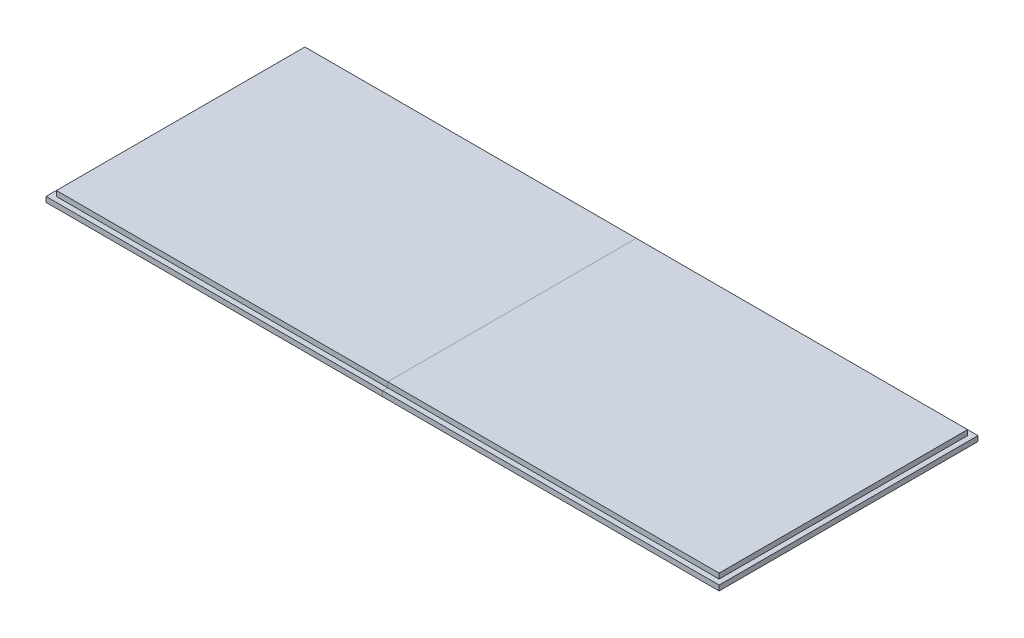
ISO-10303-21;
HEADER;
FILE_DESCRIPTION(('STEP AP214'),'2;1');
FILE_NAME('part.step','',(''),(''),'','','');
FILE_SCHEMA(('AUTOMOTIVE_DESIGN { 1 0 10303 214 1 1 1 1 }'));
ENDSEC;
DATA;
#1=APPLICATION_CONTEXT('core data for automotive mechanical design processes');
#2=APPLICATION_PROTOCOL_DEFINITION('international standard','automotive_design',2000,#1);
#3=PRODUCT_CONTEXT('',#1,'mechanical');
#4=PRODUCT('Part','Part','',(#3));
#5=PRODUCT_RELATED_PRODUCT_CATEGORY('part','',(#4));
#6=PRODUCT_DEFINITION_FORMATION('','',#4);
#7=PRODUCT_DEFINITION_CONTEXT('part definition',#1,'design');
#8=PRODUCT_DEFINITION('design','',#6,#7);
#9=PRODUCT_DEFINITION_SHAPE('','',#8);
#10=(LENGTH_UNIT() NAMED_UNIT(*) SI_UNIT(.MILLI.,.METRE.));
#11=(NAMED_UNIT(*) PLANE_ANGLE_UNIT() SI_UNIT($,.RADIAN.));
#12=(NAMED_UNIT(*) SI_UNIT($,.STERADIAN.) SOLID_ANGLE_UNIT());
#13=UNCERTAINTY_MEASURE_WITH_UNIT(LENGTH_MEASURE(1.E-05),#10,'distance_accuracy_value','');
#14=(GEOMETRIC_REPRESENTATION_CONTEXT(3) GLOBAL_UNCERTAINTY_ASSIGNED_CONTEXT((#13)) GLOBAL_UNIT_ASSIGNED_CONTEXT((#10,
#11,#12)) REPRESENTATION_CONTEXT('',''));
#15=CARTESIAN_POINT('',(0.,0.,0.));
#16=DIRECTION('',(0.,0.,1.));
#17=DIRECTION('',(1.,0.,0.));
#18=AXIS2_PLACEMENT_3D('',#15,#16,#17);
#19=CARTESIAN_POINT('',(0.,0.,0.));
#20=DIRECTION('',(1.,0.,0.));
#21=DIRECTION('',(0.,1.,0.));
#22=AXIS2_PLACEMENT_3D('',#19,#20,#21);
#23=PLANE('',#22);
#24=DIRECTION('',(0.,0.,1.));
#25=VECTOR('',#24,1.);
#26=CARTESIAN_POINT('',(0.,0.,0.));
#27=LINE('',#26,#25);
#28=CARTESIAN_POINT('',(0.,0.,-79.375));
#29=VERTEX_POINT('',#28);
#30=CARTESIAN_POINT('',(0.,0.,79.375));
#31=VERTEX_POINT('',#30);
#32=EDGE_CURVE('E176',#29,#31,#27,.T.);
#33=ORIENTED_EDGE('',*,*,#32,.F.);
#34=DIRECTION('',(0.,1.,0.));
#35=VECTOR('',#34,1.);
#36=CARTESIAN_POINT('',(0.,3.1750000000018,-79.375));
#37=LINE('',#36,#35);
#38=CARTESIAN_POINT('',(0.,3.175,-79.375));
#39=VERTEX_POINT('',#38);
#40=EDGE_CURVE('E185',#29,#39,#37,.T.);
#41=ORIENTED_EDGE('',*,*,#40,.T.);
#42=DIRECTION('',(0.,0.,1.));
#43=VECTOR('',#42,1.);
#44=CARTESIAN_POINT('',(0.,3.175,0.));
#45=LINE('',#44,#43);
#46=CARTESIAN_POINT('',(0.,3.175,-76.2));
#47=VERTEX_POINT('',#46);
#48=EDGE_CURVE('E129',#39,#47,#45,.T.);
#49=ORIENTED_EDGE('',*,*,#48,.T.);
#50=DIRECTION('',(0.,1.,0.));
#51=VECTOR('',#50,1.);
#52=CARTESIAN_POINT('',(0.,6.35000000000178,-76.2));
#53=LINE('',#52,#51);
#54=CARTESIAN_POINT('',(0.,6.35,-76.2));
#55=VERTEX_POINT('',#54);
#56=EDGE_CURVE('E118',#47,#55,#53,.T.);
#57=ORIENTED_EDGE('',*,*,#56,.T.);
#58=DIRECTION('',(0.,0.,1.));
#59=VECTOR('',#58,1.);
#60=CARTESIAN_POINT('',(0.,6.35,0.));
#61=LINE('',#60,#59);
#62=CARTESIAN_POINT('',(0.,6.35,76.2));
#63=VERTEX_POINT('',#62);
#64=EDGE_CURVE('E126',#55,#63,#61,.T.);
#65=ORIENTED_EDGE('',*,*,#64,.T.);
#66=DIRECTION('',(0.,-1.,0.));
#67=VECTOR('',#66,1.);
#68=CARTESIAN_POINT('',(0.,6.35000000000178,76.2));
#69=LINE('',#68,#67);
#70=CARTESIAN_POINT('',(0.,3.175,76.2));
#71=VERTEX_POINT('',#70);
#72=EDGE_CURVE('E132',#63,#71,#69,.T.);
#73=ORIENTED_EDGE('',*,*,#72,.T.);
#74=CARTESIAN_POINT('',(0.,3.175,79.375));
#75=VERTEX_POINT('',#74);
#76=EDGE_CURVE('E181',#71,#75,#45,.T.);
#77=ORIENTED_EDGE('',*,*,#76,.T.);
#78=DIRECTION('',(0.,-1.,0.));
#79=VECTOR('',#78,1.);
#80=CARTESIAN_POINT('',(0.,3.1750000000018,79.375));
#81=LINE('',#80,#79);
#82=EDGE_CURVE('E131',#75,#31,#81,.T.);
#83=ORIENTED_EDGE('',*,*,#82,.T.);
#84=EDGE_LOOP('',(#33,#41,#49,#57,#65,#73,#77,#83));
#85=FACE_BOUND('',#84,.T.);
#86=ADVANCED_FACE('F55',(#85),#23,.T.);
#87=CARTESIAN_POINT('',(0.,3.175,0.));
#88=DIRECTION('',(0.,-1.,0.));
#89=DIRECTION('',(0.,0.,-1.));
#90=AXIS2_PLACEMENT_3D('',#87,#88,#89);
#91=PLANE('',#90);
#92=ORIENTED_EDGE('',*,*,#48,.F.);
#93=DIRECTION('',(-1.,0.,0.));
#94=VECTOR('',#93,1.);
#95=CARTESIAN_POINT('',(-206.375,3.175,-79.375));
#96=LINE('',#95,#94);
#97=CARTESIAN_POINT('',(-206.375,3.175,-79.375));
#98=VERTEX_POINT('',#97);
#99=EDGE_CURVE('E148',#39,#98,#96,.T.);
#100=ORIENTED_EDGE('',*,*,#99,.T.);
#101=DIRECTION('',(0.,0.,1.));
#102=VECTOR('',#101,1.);
#103=CARTESIAN_POINT('',(-206.375,3.175,79.375));
#104=LINE('',#103,#102);
#105=CARTESIAN_POINT('',(-206.375,3.175,79.375));
#106=VERTEX_POINT('',#105);
#107=EDGE_CURVE('E146',#98,#106,#104,.T.);
#108=ORIENTED_EDGE('',*,*,#107,.T.);
#109=DIRECTION('',(1.,0.,0.));
#110=VECTOR('',#109,1.);
#111=CARTESIAN_POINT('',(-206.375,3.175,79.375));
#112=LINE('',#111,#110);
#113=EDGE_CURVE('E143',#106,#75,#112,.T.);
#114=ORIENTED_EDGE('',*,*,#113,.T.);
#115=ORIENTED_EDGE('',*,*,#76,.F.);
#116=DIRECTION('',(1.,0.,0.));
#117=VECTOR('',#116,1.);
#118=CARTESIAN_POINT('',(-203.2,3.175,76.2));
#119=LINE('',#118,#117);
#120=CARTESIAN_POINT('',(-203.2,3.175,76.2));
#121=VERTEX_POINT('',#120);
#122=EDGE_CURVE('E158',#121,#71,#119,.T.);
#123=ORIENTED_EDGE('',*,*,#122,.F.);
#124=DIRECTION('',(0.,0.,1.));
#125=VECTOR('',#124,1.);
#126=CARTESIAN_POINT('',(-203.2,3.175,76.2));
#127=LINE('',#126,#125);
#128=CARTESIAN_POINT('',(-203.2,3.175,-76.2));
#129=VERTEX_POINT('',#128);
#130=EDGE_CURVE('E161',#129,#121,#127,.T.);
#131=ORIENTED_EDGE('',*,*,#130,.F.);
#132=DIRECTION('',(-1.,0.,0.));
#133=VECTOR('',#132,1.);
#134=CARTESIAN_POINT('',(-203.2,3.175,-76.2));
#135=LINE('',#134,#133);
#136=EDGE_CURVE('E162',#47,#129,#135,.T.);
#137=ORIENTED_EDGE('',*,*,#136,.F.);
#138=EDGE_LOOP('',(#92,#100,#108,#114,#115,#123,#131,#137));
#139=FACE_BOUND('',#138,.T.);
#140=ADVANCED_FACE('F222',(#139),#91,.F.);
#141=CARTESIAN_POINT('',(0.,0.,0.));
#142=DIRECTION('',(0.,-1.,0.));
#143=DIRECTION('',(0.,0.,-1.));
#144=AXIS2_PLACEMENT_3D('',#141,#142,#143);
#145=PLANE('',#144);
#146=DIRECTION('',(-1.,0.,0.));
#147=VECTOR('',#146,1.);
#148=CARTESIAN_POINT('',(-206.375,0.,-79.375));
#149=LINE('',#148,#147);
#150=CARTESIAN_POINT('',(-206.375,0.,-79.375));
#151=VERTEX_POINT('',#150);
#152=EDGE_CURVE('E155',#29,#151,#149,.T.);
#153=ORIENTED_EDGE('',*,*,#152,.F.);
#154=ORIENTED_EDGE('',*,*,#32,.T.);
#155=DIRECTION('',(1.,0.,0.));
#156=VECTOR('',#155,1.);
#157=CARTESIAN_POINT('',(-206.375,0.,79.375));
#158=LINE('',#157,#156);
#159=CARTESIAN_POINT('',(-206.375,0.,79.375));
#160=VERTEX_POINT('',#159);
#161=EDGE_CURVE('E151',#160,#31,#158,.T.);
#162=ORIENTED_EDGE('',*,*,#161,.F.);
#163=DIRECTION('',(0.,0.,1.));
#164=VECTOR('',#163,1.);
#165=CARTESIAN_POINT('',(-206.375,0.,79.375));
#166=LINE('',#165,#164);
#167=EDGE_CURVE('E154',#151,#160,#166,.T.);
#168=ORIENTED_EDGE('',*,*,#167,.F.);
#169=EDGE_LOOP('',(#153,#154,#162,#168));
#170=FACE_BOUND('',#169,.T.);
#171=ADVANCED_FACE('F201',(#170),#145,.T.);
#172=CARTESIAN_POINT('',(-206.375,3.175,-79.375));
#173=DIRECTION('',(0.,0.,1.));
#174=DIRECTION('',(1.,0.,0.));
#175=AXIS2_PLACEMENT_3D('',#172,#173,#174);
#176=PLANE('',#175);
#177=ORIENTED_EDGE('',*,*,#40,.F.);
#178=ORIENTED_EDGE('',*,*,#152,.T.);
#179=DIRECTION('',(0.,-1.,0.));
#180=VECTOR('',#179,1.);
#181=CARTESIAN_POINT('',(-206.375,3.175,-79.375));
#182=LINE('',#181,#180);
#183=EDGE_CURVE('E180',#98,#151,#182,.T.);
#184=ORIENTED_EDGE('',*,*,#183,.F.);
#185=ORIENTED_EDGE('',*,*,#99,.F.);
#186=EDGE_LOOP('',(#177,#178,#184,#185));
#187=FACE_BOUND('',#186,.T.);
#188=ADVANCED_FACE('F57',(#187),#176,.F.);
#189=CARTESIAN_POINT('',(-206.375,3.175,79.375));
#190=DIRECTION('',(0.,0.,-1.));
#191=DIRECTION('',(-1.,0.,0.));
#192=AXIS2_PLACEMENT_3D('',#189,#190,#191);
#193=PLANE('',#192);
#194=ORIENTED_EDGE('',*,*,#82,.F.);
#195=ORIENTED_EDGE('',*,*,#113,.F.);
#196=DIRECTION('',(0.,-1.,0.));
#197=VECTOR('',#196,1.);
#198=CARTESIAN_POINT('',(-206.375,3.175,79.375));
#199=LINE('',#198,#197);
#200=EDGE_CURVE('E147',#106,#160,#199,.T.);
#201=ORIENTED_EDGE('',*,*,#200,.T.);
#202=ORIENTED_EDGE('',*,*,#161,.T.);
#203=EDGE_LOOP('',(#194,#195,#201,#202));
#204=FACE_BOUND('',#203,.T.);
#205=ADVANCED_FACE('F195',(#204),#193,.F.);
#206=CARTESIAN_POINT('',(-203.2,6.35,-76.2));
#207=DIRECTION('',(0.,0.,1.));
#208=DIRECTION('',(1.,0.,0.));
#209=AXIS2_PLACEMENT_3D('',#206,#207,#208);
#210=PLANE('',#209);
#211=ORIENTED_EDGE('',*,*,#56,.F.);
#212=ORIENTED_EDGE('',*,*,#136,.T.);
#213=DIRECTION('',(0.,-1.,0.));
#214=VECTOR('',#213,1.);
#215=CARTESIAN_POINT('',(-203.2,6.35,-76.2));
#216=LINE('',#215,#214);
#217=CARTESIAN_POINT('',(-203.2,6.35,-76.2));
#218=VERTEX_POINT('',#217);
#219=EDGE_CURVE('E120',#218,#129,#216,.T.);
#220=ORIENTED_EDGE('',*,*,#219,.F.);
#221=DIRECTION('',(-1.,0.,0.));
#222=VECTOR('',#221,1.);
#223=CARTESIAN_POINT('',(-203.2,6.35,-76.2));
#224=LINE('',#223,#222);
#225=EDGE_CURVE('E12',#55,#218,#224,.T.);
#226=ORIENTED_EDGE('',*,*,#225,.F.);
#227=EDGE_LOOP('',(#211,#212,#220,#226));
#228=FACE_BOUND('',#227,.T.);
#229=ADVANCED_FACE('F117',(#228),#210,.F.);
#230=CARTESIAN_POINT('',(-203.2,6.35,76.2));
#231=DIRECTION('',(0.,0.,-1.));
#232=DIRECTION('',(-1.,0.,0.));
#233=AXIS2_PLACEMENT_3D('',#230,#231,#232);
#234=PLANE('',#233);
#235=ORIENTED_EDGE('',*,*,#72,.F.);
#236=DIRECTION('',(1.,0.,0.));
#237=VECTOR('',#236,1.);
#238=CARTESIAN_POINT('',(-203.2,6.35,76.2));
#239=LINE('',#238,#237);
#240=CARTESIAN_POINT('',(-203.2,6.35,76.2));
#241=VERTEX_POINT('',#240);
#242=EDGE_CURVE('E136',#241,#63,#239,.T.);
#243=ORIENTED_EDGE('',*,*,#242,.F.);
#244=DIRECTION('',(0.,-1.,0.));
#245=VECTOR('',#244,1.);
#246=CARTESIAN_POINT('',(-203.2,6.35,76.2));
#247=LINE('',#246,#245);
#248=EDGE_CURVE('E165',#241,#121,#247,.T.);
#249=ORIENTED_EDGE('',*,*,#248,.T.);
#250=ORIENTED_EDGE('',*,*,#122,.T.);
#251=EDGE_LOOP('',(#235,#243,#249,#250));
#252=FACE_BOUND('',#251,.T.);
#253=ADVANCED_FACE('F223',(#252),#234,.F.);
#254=CARTESIAN_POINT('',(0.,6.35,0.));
#255=DIRECTION('',(0.,-1.,0.));
#256=DIRECTION('',(0.,0.,-1.));
#257=AXIS2_PLACEMENT_3D('',#254,#255,#256);
#258=PLANE('',#257);
#259=ORIENTED_EDGE('',*,*,#64,.F.);
#260=ORIENTED_EDGE('',*,*,#225,.T.);
#261=DIRECTION('',(0.,0.,1.));
#262=VECTOR('',#261,1.);
#263=CARTESIAN_POINT('',(-203.2,6.35,76.2));
#264=LINE('',#263,#262);
#265=EDGE_CURVE('E64',#218,#241,#264,.T.);
#266=ORIENTED_EDGE('',*,*,#265,.T.);
#267=ORIENTED_EDGE('',*,*,#242,.T.);
#268=EDGE_LOOP('',(#259,#260,#266,#267));
#269=FACE_BOUND('',#268,.T.);
#270=ADVANCED_FACE('F134',(#269),#258,.F.);
#271=CARTESIAN_POINT('',(-206.375,3.175,79.375));
#272=DIRECTION('',(1.,0.,0.));
#273=DIRECTION('',(0.,0.,-1.));
#274=AXIS2_PLACEMENT_3D('',#271,#272,#273);
#275=PLANE('',#274);
#276=ORIENTED_EDGE('',*,*,#167,.T.);
#277=ORIENTED_EDGE('',*,*,#200,.F.);
#278=ORIENTED_EDGE('',*,*,#107,.F.);
#279=ORIENTED_EDGE('',*,*,#183,.T.);
#280=EDGE_LOOP('',(#276,#277,#278,#279));
#281=FACE_BOUND('',#280,.T.);
#282=ADVANCED_FACE('F207',(#281),#275,.F.);
#283=CARTESIAN_POINT('',(-203.2,6.35,76.2));
#284=DIRECTION('',(1.,0.,0.));
#285=DIRECTION('',(0.,0.,-1.));
#286=AXIS2_PLACEMENT_3D('',#283,#284,#285);
#287=PLANE('',#286);
#288=ORIENTED_EDGE('',*,*,#219,.T.);
#289=ORIENTED_EDGE('',*,*,#130,.T.);
#290=ORIENTED_EDGE('',*,*,#248,.F.);
#291=ORIENTED_EDGE('',*,*,#265,.F.);
#292=EDGE_LOOP('',(#288,#289,#290,#291));
#293=FACE_BOUND('',#292,.T.);
#294=ADVANCED_FACE('F220',(#293),#287,.F.);
#295=CLOSED_SHELL('',(#86,#140,#171,#188,#205,#229,#253,#270,#282,#294));
#296=MANIFOLD_SOLID_BREP('B2',#295);
#297=CARTESIAN_POINT('',(0.,0.,0.));
#298=DIRECTION('',(1.,0.,0.));
#299=DIRECTION('',(0.,1.,0.));
#300=AXIS2_PLACEMENT_3D('',#297,#298,#299);
#301=PLANE('',#300);
#302=DIRECTION('',(0.,0.,1.));
#303=VECTOR('',#302,1.);
#304=CARTESIAN_POINT('',(0.,0.,0.));
#305=LINE('',#304,#303);
#306=CARTESIAN_POINT('',(0.,0.,-79.375));
#307=VERTEX_POINT('',#306);
#308=CARTESIAN_POINT('',(0.,0.,79.375));
#309=VERTEX_POINT('',#308);
#310=EDGE_CURVE('E53',#307,#309,#305,.T.);
#311=ORIENTED_EDGE('',*,*,#310,.T.);
#312=DIRECTION('',(0.,-1.,0.));
#313=VECTOR('',#312,1.);
#314=CARTESIAN_POINT('',(0.,3.1750000000018,79.375));
#315=LINE('',#314,#313);
#316=CARTESIAN_POINT('',(0.,3.175,79.375));
#317=VERTEX_POINT('',#316);
#318=EDGE_CURVE('E448',#317,#309,#315,.T.);
#319=ORIENTED_EDGE('',*,*,#318,.F.);
#320=DIRECTION('',(0.,0.,1.));
#321=VECTOR('',#320,1.);
#322=CARTESIAN_POINT('',(0.,3.175,0.));
#323=LINE('',#322,#321);
#324=CARTESIAN_POINT('',(0.,3.175,76.2));
#325=VERTEX_POINT('',#324);
#326=EDGE_CURVE('E451',#325,#317,#323,.T.);
#327=ORIENTED_EDGE('',*,*,#326,.F.);
#328=DIRECTION('',(0.,-1.,0.));
#329=VECTOR('',#328,1.);
#330=CARTESIAN_POINT('',(0.,6.35000000000178,76.2));
#331=LINE('',#330,#329);
#332=CARTESIAN_POINT('',(0.,6.35,76.2));
#333=VERTEX_POINT('',#332);
#334=EDGE_CURVE('E443',#333,#325,#331,.T.);
#335=ORIENTED_EDGE('',*,*,#334,.F.);
#336=DIRECTION('',(0.,0.,1.));
#337=VECTOR('',#336,1.);
#338=CARTESIAN_POINT('',(0.,6.35,0.));
#339=LINE('',#338,#337);
#340=CARTESIAN_POINT('',(0.,6.35,-76.2));
#341=VERTEX_POINT('',#340);
#342=EDGE_CURVE('E440',#341,#333,#339,.T.);
#343=ORIENTED_EDGE('',*,*,#342,.F.);
#344=DIRECTION('',(0.,1.,0.));
#345=VECTOR('',#344,1.);
#346=CARTESIAN_POINT('',(0.,6.35000000000178,-76.2));
#347=LINE('',#346,#345);
#348=CARTESIAN_POINT('',(0.,3.175,-76.2));
#349=VERTEX_POINT('',#348);
#350=EDGE_CURVE('E377',#349,#341,#347,.T.);
#351=ORIENTED_EDGE('',*,*,#350,.F.);
#352=CARTESIAN_POINT('',(0.,3.175,-79.375));
#353=VERTEX_POINT('',#352);
#354=EDGE_CURVE('E315',#353,#349,#323,.T.);
#355=ORIENTED_EDGE('',*,*,#354,.F.);
#356=DIRECTION('',(0.,1.,0.));
#357=VECTOR('',#356,1.);
#358=CARTESIAN_POINT('',(0.,3.1750000000018,-79.375));
#359=LINE('',#358,#357);
#360=EDGE_CURVE('E322',#307,#353,#359,.T.);
#361=ORIENTED_EDGE('',*,*,#360,.F.);
#362=EDGE_LOOP('',(#311,#319,#327,#335,#343,#351,#355,#361));
#363=FACE_BOUND('',#362,.T.);
#364=ADVANCED_FACE('F307',(#363),#301,.F.);
#365=CARTESIAN_POINT('',(206.375,3.175,79.375));
#366=DIRECTION('',(-1.,0.,0.));
#367=DIRECTION('',(0.,0.,1.));
#368=AXIS2_PLACEMENT_3D('',#365,#366,#367);
#369=PLANE('',#368);
#370=DIRECTION('',(0.,0.,-1.));
#371=VECTOR('',#370,1.);
#372=CARTESIAN_POINT('',(206.375,0.,79.375));
#373=LINE('',#372,#371);
#374=CARTESIAN_POINT('',(206.375,0.,79.375));
#375=VERTEX_POINT('',#374);
#376=CARTESIAN_POINT('',(206.375,0.,-79.375));
#377=VERTEX_POINT('',#376);
#378=EDGE_CURVE('E411',#375,#377,#373,.T.);
#379=ORIENTED_EDGE('',*,*,#378,.T.);
#380=DIRECTION('',(0.,-1.,0.));
#381=VECTOR('',#380,1.);
#382=CARTESIAN_POINT('',(206.375,3.175,-79.375));
#383=LINE('',#382,#381);
#384=CARTESIAN_POINT('',(206.375,3.175,-79.375));
#385=VERTEX_POINT('',#384);
#386=EDGE_CURVE('E436',#385,#377,#383,.T.);
#387=ORIENTED_EDGE('',*,*,#386,.F.);
#388=DIRECTION('',(0.,0.,-1.));
#389=VECTOR('',#388,1.);
#390=CARTESIAN_POINT('',(206.375,3.175,79.375));
#391=LINE('',#390,#389);
#392=CARTESIAN_POINT('',(206.375,3.175,79.375));
#393=VERTEX_POINT('',#392);
#394=EDGE_CURVE('E412',#393,#385,#391,.T.);
#395=ORIENTED_EDGE('',*,*,#394,.F.);
#396=DIRECTION('',(0.,-1.,0.));
#397=VECTOR('',#396,1.);
#398=CARTESIAN_POINT('',(206.375,3.175,79.375));
#399=LINE('',#398,#397);
#400=EDGE_CURVE('E424',#393,#375,#399,.T.);
#401=ORIENTED_EDGE('',*,*,#400,.T.);
#402=EDGE_LOOP('',(#379,#387,#395,#401));
#403=FACE_BOUND('',#402,.T.);
#404=ADVANCED_FACE('F470',(#403),#369,.F.);
#405=CARTESIAN_POINT('',(0.,0.,0.));
#406=DIRECTION('',(0.,-1.,0.));
#407=DIRECTION('',(0.,0.,-1.));
#408=AXIS2_PLACEMENT_3D('',#405,#406,#407);
#409=PLANE('',#408);
#410=ORIENTED_EDGE('',*,*,#310,.F.);
#411=DIRECTION('',(-1.,0.,0.));
#412=VECTOR('',#411,1.);
#413=CARTESIAN_POINT('',(-206.375,0.,-79.375));
#414=LINE('',#413,#412);
#415=EDGE_CURVE('E428',#377,#307,#414,.T.);
#416=ORIENTED_EDGE('',*,*,#415,.F.);
#417=ORIENTED_EDGE('',*,*,#378,.F.);
#418=DIRECTION('',(1.,0.,0.));
#419=VECTOR('',#418,1.);
#420=CARTESIAN_POINT('',(-206.375,0.,79.375));
#421=LINE('',#420,#419);
#422=EDGE_CURVE('E417',#309,#375,#421,.T.);
#423=ORIENTED_EDGE('',*,*,#422,.F.);
#424=EDGE_LOOP('',(#410,#416,#417,#423));
#425=FACE_BOUND('',#424,.T.);
#426=ADVANCED_FACE('F473',(#425),#409,.T.);
#427=CARTESIAN_POINT('',(0.,3.175,0.));
#428=DIRECTION('',(0.,-1.,0.));
#429=DIRECTION('',(0.,0.,-1.));
#430=AXIS2_PLACEMENT_3D('',#427,#428,#429);
#431=PLANE('',#430);
#432=DIRECTION('',(-1.,0.,0.));
#433=VECTOR('',#432,1.);
#434=CARTESIAN_POINT('',(-206.375,3.175,-79.375));
#435=LINE('',#434,#433);
#436=EDGE_CURVE('E416',#385,#353,#435,.T.);
#437=ORIENTED_EDGE('',*,*,#436,.T.);
#438=ORIENTED_EDGE('',*,*,#354,.T.);
#439=DIRECTION('',(-1.,0.,0.));
#440=VECTOR('',#439,1.);
#441=CARTESIAN_POINT('',(-203.2,3.175,-76.2));
#442=LINE('',#441,#440);
#443=CARTESIAN_POINT('',(203.2,3.175,-76.2));
#444=VERTEX_POINT('',#443);
#445=EDGE_CURVE('E401',#444,#349,#442,.T.);
#446=ORIENTED_EDGE('',*,*,#445,.F.);
#447=DIRECTION('',(0.,0.,-1.));
#448=VECTOR('',#447,1.);
#449=CARTESIAN_POINT('',(203.2,3.175,76.2));
#450=LINE('',#449,#448);
#451=CARTESIAN_POINT('',(203.2,3.175,76.2));
#452=VERTEX_POINT('',#451);
#453=EDGE_CURVE('E395',#452,#444,#450,.T.);
#454=ORIENTED_EDGE('',*,*,#453,.F.);
#455=DIRECTION('',(1.,0.,0.));
#456=VECTOR('',#455,1.);
#457=CARTESIAN_POINT('',(-203.2,3.175,76.2));
#458=LINE('',#457,#456);
#459=EDGE_CURVE('E408',#325,#452,#458,.T.);
#460=ORIENTED_EDGE('',*,*,#459,.F.);
#461=ORIENTED_EDGE('',*,*,#326,.T.);
#462=DIRECTION('',(1.,0.,0.));
#463=VECTOR('',#462,1.);
#464=CARTESIAN_POINT('',(-206.375,3.175,79.375));
#465=LINE('',#464,#463);
#466=EDGE_CURVE('E421',#317,#393,#465,.T.);
#467=ORIENTED_EDGE('',*,*,#466,.T.);
#468=ORIENTED_EDGE('',*,*,#394,.T.);
#469=EDGE_LOOP('',(#437,#438,#446,#454,#460,#461,#467,#468));
#470=FACE_BOUND('',#469,.T.);
#471=ADVANCED_FACE('F459',(#470),#431,.F.);
#472=CARTESIAN_POINT('',(203.2,6.35,76.2));
#473=DIRECTION('',(-1.,0.,0.));
#474=DIRECTION('',(0.,0.,1.));
#475=AXIS2_PLACEMENT_3D('',#472,#473,#474);
#476=PLANE('',#475);
#477=DIRECTION('',(0.,-1.,0.));
#478=VECTOR('',#477,1.);
#479=CARTESIAN_POINT('',(203.2,6.35,76.2));
#480=LINE('',#479,#478);
#481=CARTESIAN_POINT('',(203.2,6.35,76.2));
#482=VERTEX_POINT('',#481);
#483=EDGE_CURVE('E397',#482,#452,#480,.T.);
#484=ORIENTED_EDGE('',*,*,#483,.T.);
#485=ORIENTED_EDGE('',*,*,#453,.T.);
#486=DIRECTION('',(0.,-1.,0.));
#487=VECTOR('',#486,1.);
#488=CARTESIAN_POINT('',(203.2,6.35,-76.2));
#489=LINE('',#488,#487);
#490=CARTESIAN_POINT('',(203.2,6.35,-76.2));
#491=VERTEX_POINT('',#490);
#492=EDGE_CURVE('E375',#491,#444,#489,.T.);
#493=ORIENTED_EDGE('',*,*,#492,.F.);
#494=DIRECTION('',(0.,0.,-1.));
#495=VECTOR('',#494,1.);
#496=CARTESIAN_POINT('',(203.2,6.35,76.2));
#497=LINE('',#496,#495);
#498=EDGE_CURVE('E382',#482,#491,#497,.T.);
#499=ORIENTED_EDGE('',*,*,#498,.F.);
#500=EDGE_LOOP('',(#484,#485,#493,#499));
#501=FACE_BOUND('',#500,.T.);
#502=ADVANCED_FACE('F393',(#501),#476,.F.);
#503=CARTESIAN_POINT('',(-203.2,6.35,76.2));
#504=DIRECTION('',(0.,0.,-1.));
#505=DIRECTION('',(-1.,0.,0.));
#506=AXIS2_PLACEMENT_3D('',#503,#504,#505);
#507=PLANE('',#506);
#508=DIRECTION('',(1.,0.,0.));
#509=VECTOR('',#508,1.);
#510=CARTESIAN_POINT('',(-203.2,6.35,76.2));
#511=LINE('',#510,#509);
#512=EDGE_CURVE('E381',#333,#482,#511,.T.);
#513=ORIENTED_EDGE('',*,*,#512,.F.);
#514=ORIENTED_EDGE('',*,*,#334,.T.);
#515=ORIENTED_EDGE('',*,*,#459,.T.);
#516=ORIENTED_EDGE('',*,*,#483,.F.);
#517=EDGE_LOOP('',(#513,#514,#515,#516));
#518=FACE_BOUND('',#517,.T.);
#519=ADVANCED_FACE('F498',(#518),#507,.F.);
#520=CARTESIAN_POINT('',(-203.2,6.35,-76.2));
#521=DIRECTION('',(0.,0.,1.));
#522=DIRECTION('',(1.,0.,0.));
#523=AXIS2_PLACEMENT_3D('',#520,#521,#522);
#524=PLANE('',#523);
#525=ORIENTED_EDGE('',*,*,#445,.T.);
#526=ORIENTED_EDGE('',*,*,#350,.T.);
#527=DIRECTION('',(-1.,0.,0.));
#528=VECTOR('',#527,1.);
#529=CARTESIAN_POINT('',(-203.2,6.35,-76.2));
#530=LINE('',#529,#528);
#531=EDGE_CURVE('E370',#491,#341,#530,.T.);
#532=ORIENTED_EDGE('',*,*,#531,.F.);
#533=ORIENTED_EDGE('',*,*,#492,.T.);
#534=EDGE_LOOP('',(#525,#526,#532,#533));
#535=FACE_BOUND('',#534,.T.);
#536=ADVANCED_FACE('F373',(#535),#524,.F.);
#537=CARTESIAN_POINT('',(0.,6.35,0.));
#538=DIRECTION('',(0.,-1.,0.));
#539=DIRECTION('',(0.,0.,-1.));
#540=AXIS2_PLACEMENT_3D('',#537,#538,#539);
#541=PLANE('',#540);
#542=ORIENTED_EDGE('',*,*,#531,.T.);
#543=ORIENTED_EDGE('',*,*,#342,.T.);
#544=ORIENTED_EDGE('',*,*,#512,.T.);
#545=ORIENTED_EDGE('',*,*,#498,.T.);
#546=EDGE_LOOP('',(#542,#543,#544,#545));
#547=FACE_BOUND('',#546,.T.);
#548=ADVANCED_FACE('F385',(#547),#541,.F.);
#549=CARTESIAN_POINT('',(-206.375,3.175,79.375));
#550=DIRECTION('',(0.,0.,-1.));
#551=DIRECTION('',(-1.,0.,0.));
#552=AXIS2_PLACEMENT_3D('',#549,#550,#551);
#553=PLANE('',#552);
#554=ORIENTED_EDGE('',*,*,#466,.F.);
#555=ORIENTED_EDGE('',*,*,#318,.T.);
#556=ORIENTED_EDGE('',*,*,#422,.T.);
#557=ORIENTED_EDGE('',*,*,#400,.F.);
#558=EDGE_LOOP('',(#554,#555,#556,#557));
#559=FACE_BOUND('',#558,.T.);
#560=ADVANCED_FACE('F465',(#559),#553,.F.);
#561=CARTESIAN_POINT('',(-206.375,3.175,-79.375));
#562=DIRECTION('',(0.,0.,1.));
#563=DIRECTION('',(1.,0.,0.));
#564=AXIS2_PLACEMENT_3D('',#561,#562,#563);
#565=PLANE('',#564);
#566=ORIENTED_EDGE('',*,*,#415,.T.);
#567=ORIENTED_EDGE('',*,*,#360,.T.);
#568=ORIENTED_EDGE('',*,*,#436,.F.);
#569=ORIENTED_EDGE('',*,*,#386,.T.);
#570=EDGE_LOOP('',(#566,#567,#568,#569));
#571=FACE_BOUND('',#570,.T.);
#572=ADVANCED_FACE('F471',(#571),#565,.F.);
#573=CLOSED_SHELL('',(#364,#404,#426,#471,#502,#519,#536,#548,#560,#572));
#574=MANIFOLD_SOLID_BREP('B6',#573);
#575=ADVANCED_BREP_SHAPE_REPRESENTATION('',(#18,#296,#574),#14);
#576=SHAPE_DEFINITION_REPRESENTATION(#9,#575);
ENDSEC;
END-ISO-10303-21;
